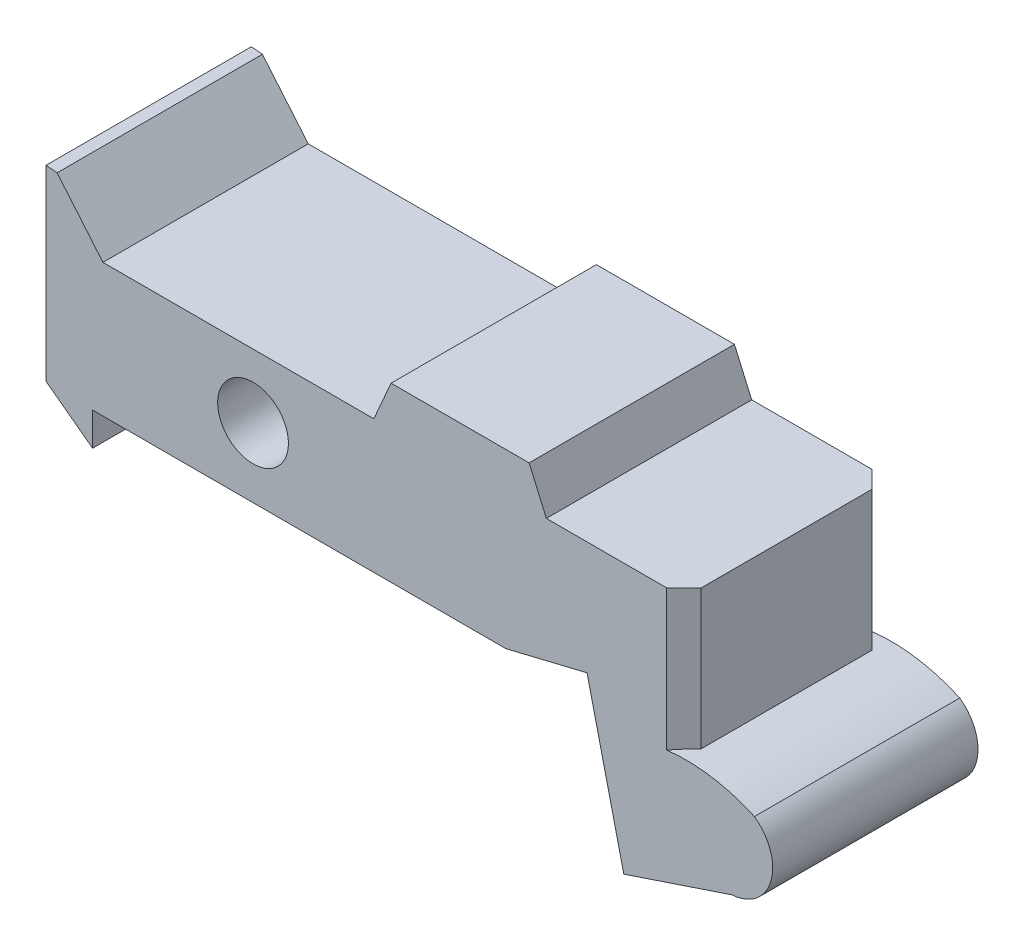
ISO-10303-21;
HEADER;
FILE_DESCRIPTION(('STEP AP214'),'2;1');
FILE_NAME('part.step','',(''),(''),'','','');
FILE_SCHEMA(('AUTOMOTIVE_DESIGN { 1 0 10303 214 1 1 1 1 }'));
ENDSEC;
DATA;
#1=APPLICATION_CONTEXT('core data for automotive mechanical design processes');
#2=APPLICATION_PROTOCOL_DEFINITION('international standard','automotive_design',2000,#1);
#3=PRODUCT_CONTEXT('',#1,'mechanical');
#4=PRODUCT('Part','Part','',(#3));
#5=PRODUCT_RELATED_PRODUCT_CATEGORY('part','',(#4));
#6=PRODUCT_DEFINITION_FORMATION('','',#4);
#7=PRODUCT_DEFINITION_CONTEXT('part definition',#1,'design');
#8=PRODUCT_DEFINITION('design','',#6,#7);
#9=PRODUCT_DEFINITION_SHAPE('','',#8);
#10=(LENGTH_UNIT() NAMED_UNIT(*) SI_UNIT(.MILLI.,.METRE.));
#11=(NAMED_UNIT(*) PLANE_ANGLE_UNIT() SI_UNIT($,.RADIAN.));
#12=(NAMED_UNIT(*) SI_UNIT($,.STERADIAN.) SOLID_ANGLE_UNIT());
#13=UNCERTAINTY_MEASURE_WITH_UNIT(LENGTH_MEASURE(1.E-05),#10,'distance_accuracy_value','');
#14=(GEOMETRIC_REPRESENTATION_CONTEXT(3) GLOBAL_UNCERTAINTY_ASSIGNED_CONTEXT((#13)) GLOBAL_UNIT_ASSIGNED_CONTEXT((#10,
#11,#12)) REPRESENTATION_CONTEXT('',''));
#15=CARTESIAN_POINT('',(0.,0.,0.));
#16=DIRECTION('',(0.,0.,1.));
#17=DIRECTION('',(1.,0.,0.));
#18=AXIS2_PLACEMENT_3D('',#15,#16,#17);
#19=CARTESIAN_POINT('',(27.5853303167742,-7.28137278331035,5.95));
#20=DIRECTION('',(0.,0.,-1.));
#21=DIRECTION('',(-1.,0.,0.));
#22=AXIS2_PLACEMENT_3D('',#19,#20,#21);
#23=PLANE('',#22);
#24=DIRECTION('',(-0.6427645261851,0.766063811883869,0.));
#25=VECTOR('',#24,1.);
#26=CARTESIAN_POINT('',(-12.,7.64572185949126,5.95));
#27=LINE('',#26,#25);
#28=CARTESIAN_POINT('',(-8.7,3.71269432572104,5.95));
#29=VERTEX_POINT('',#28);
#30=CARTESIAN_POINT('',(-11.3572354738149,6.8796580476074,5.95));
#31=VERTEX_POINT('',#30);
#32=EDGE_CURVE('E281',#29,#31,#27,.T.);
#33=ORIENTED_EDGE('',*,*,#32,.T.);
#34=DIRECTION('',(0.996192071376342,-0.0871857610330573,0.));
#35=VECTOR('',#34,1.);
#36=CARTESIAN_POINT('',(-12.,6.93591217368478,5.95));
#37=LINE('',#36,#35);
#38=CARTESIAN_POINT('',(-12.,6.93591217368478,5.95));
#39=VERTEX_POINT('',#38);
#40=EDGE_CURVE('E11',#31,#39,#37,.F.);
#41=ORIENTED_EDGE('',*,*,#40,.T.);
#42=DIRECTION('',(0.,-1.,0.));
#43=VECTOR('',#42,1.);
#44=CARTESIAN_POINT('',(-12.,4.14572185949126,5.95));
#45=LINE('',#44,#43);
#46=CARTESIAN_POINT('',(-12.,-3.90650539813591,5.95));
#47=VERTEX_POINT('',#46);
#48=EDGE_CURVE('E279',#39,#47,#45,.T.);
#49=ORIENTED_EDGE('',*,*,#48,.T.);
#50=DIRECTION('',(0.802165453491212,-0.597101821488796,0.));
#51=VECTOR('',#50,1.);
#52=CARTESIAN_POINT('',(-9.3,-5.91628394320188,5.95));
#53=LINE('',#52,#51);
#54=CARTESIAN_POINT('',(-9.3,-5.91628394320188,5.95));
#55=VERTEX_POINT('',#54);
#56=EDGE_CURVE('E277',#47,#55,#53,.T.);
#57=ORIENTED_EDGE('',*,*,#56,.T.);
#58=DIRECTION('',(0.,1.,0.));
#59=VECTOR('',#58,1.);
#60=CARTESIAN_POINT('',(-9.3,-4.,5.95));
#61=LINE('',#60,#59);
#62=CARTESIAN_POINT('',(-9.3,-4.,5.95));
#63=VERTEX_POINT('',#62);
#64=EDGE_CURVE('E275',#55,#63,#61,.T.);
#65=ORIENTED_EDGE('',*,*,#64,.T.);
#66=DIRECTION('',(1.,0.,0.));
#67=VECTOR('',#66,1.);
#68=CARTESIAN_POINT('',(-9.3,-4.,5.95));
#69=LINE('',#68,#67);
#70=CARTESIAN_POINT('',(14.656995803992,-4.,5.95));
#71=VERTEX_POINT('',#70);
#72=EDGE_CURVE('E273',#63,#71,#69,.T.);
#73=ORIENTED_EDGE('',*,*,#72,.T.);
#74=DIRECTION('',(0.971766267082924,0.235945591524233,0.));
#75=VECTOR('',#74,1.);
#76=CARTESIAN_POINT('',(14.656995803992,-4.,5.95));
#77=LINE('',#76,#75);
#78=CARTESIAN_POINT('',(19.3574684820404,-2.85872164528326,5.95));
#79=VERTEX_POINT('',#78);
#80=EDGE_CURVE('E201',#71,#79,#77,.T.);
#81=ORIENTED_EDGE('',*,*,#80,.T.);
#82=DIRECTION('',(0.229400824987985,-0.973332040721373,0.));
#83=VECTOR('',#82,1.);
#84=CARTESIAN_POINT('',(19.3574684820404,-2.85872164528326,5.95));
#85=LINE('',#84,#83);
#86=CARTESIAN_POINT('',(21.4882542868643,-11.8995003602598,5.95));
#87=VERTEX_POINT('',#86);
#88=EDGE_CURVE('E270',#79,#87,#85,.T.);
#89=ORIENTED_EDGE('',*,*,#88,.T.);
#90=DIRECTION('',(0.94847360678209,0.316856145968125,0.));
#91=VECTOR('',#90,1.);
#92=CARTESIAN_POINT('',(21.4882542868643,-11.8995003602598,5.95));
#93=LINE('',#92,#91);
#94=CARTESIAN_POINT('',(27.7466733727971,-9.80875314574336,5.95));
#95=VERTEX_POINT('',#94);
#96=EDGE_CURVE('E268',#87,#95,#93,.T.);
#97=ORIENTED_EDGE('',*,*,#96,.T.);
#98=CARTESIAN_POINT('',(27.5853303167742,-7.28137278331035,5.95));
#99=DIRECTION('',(0.,0.,1.));
#100=DIRECTION('',(-1.,0.,0.));
#101=AXIS2_PLACEMENT_3D('',#98,#99,#100);
#102=CIRCLE('',#101,2.53252503998259);
#103=CARTESIAN_POINT('',(29.0593321400907,-5.22200353448717,5.95));
#104=VERTEX_POINT('',#103);
#105=EDGE_CURVE('E266',#95,#104,#102,.T.);
#106=ORIENTED_EDGE('',*,*,#105,.T.);
#107=CARTESIAN_POINT('',(25.0886263646088,-13.9791283178024,5.95));
#108=DIRECTION('',(0.,0.,1.));
#109=DIRECTION('',(-1.,0.,0.));
#110=AXIS2_PLACEMENT_3D('',#107,#108,#109);
#111=CIRCLE('',#110,9.61528672614601);
#112=CARTESIAN_POINT('',(23.9748148702064,-4.42857007333647,5.95));
#113=VERTEX_POINT('',#112);
#114=EDGE_CURVE('E231',#104,#113,#111,.T.);
#115=ORIENTED_EDGE('',*,*,#114,.T.);
#116=DIRECTION('',(0.,1.,0.));
#117=VECTOR('',#116,1.);
#118=CARTESIAN_POINT('',(23.9748148702064,-7.28137278331035,5.95));
#119=LINE('',#118,#117);
#120=CARTESIAN_POINT('',(23.9748148702064,3.71269432572104,5.95));
#121=VERTEX_POINT('',#120);
#122=EDGE_CURVE('E409',#113,#121,#119,.T.);
#123=ORIENTED_EDGE('',*,*,#122,.T.);
#124=DIRECTION('',(-1.,0.,0.));
#125=VECTOR('',#124,1.);
#126=CARTESIAN_POINT('',(24.9748148702064,3.71269432572104,5.95));
#127=LINE('',#126,#125);
#128=CARTESIAN_POINT('',(17.,3.71269432572104,5.95));
#129=VERTEX_POINT('',#128);
#130=EDGE_CURVE('E234',#121,#129,#127,.T.);
#131=ORIENTED_EDGE('',*,*,#130,.T.);
#132=DIRECTION('',(-0.400584727732144,0.916259720771226,0.));
#133=VECTOR('',#132,1.);
#134=CARTESIAN_POINT('',(17.,3.71269432572104,5.95));
#135=LINE('',#134,#133);
#136=CARTESIAN_POINT('',(16.,6.,5.95));
#137=VERTEX_POINT('',#136);
#138=EDGE_CURVE('E289',#129,#137,#135,.T.);
#139=ORIENTED_EDGE('',*,*,#138,.T.);
#140=DIRECTION('',(-1.,0.,0.));
#141=VECTOR('',#140,1.);
#142=CARTESIAN_POINT('',(16.,6.,5.95));
#143=LINE('',#142,#141);
#144=CARTESIAN_POINT('',(8.,6.,5.95));
#145=VERTEX_POINT('',#144);
#146=EDGE_CURVE('E287',#137,#145,#143,.T.);
#147=ORIENTED_EDGE('',*,*,#146,.T.);
#148=DIRECTION('',(-0.400584727732145,-0.916259720771225,0.));
#149=VECTOR('',#148,1.);
#150=CARTESIAN_POINT('',(8.,6.,5.95));
#151=LINE('',#150,#149);
#152=CARTESIAN_POINT('',(7.,3.71269432572104,5.95));
#153=VERTEX_POINT('',#152);
#154=EDGE_CURVE('E285',#145,#153,#151,.T.);
#155=ORIENTED_EDGE('',*,*,#154,.T.);
#156=DIRECTION('',(-1.,0.,0.));
#157=VECTOR('',#156,1.);
#158=CARTESIAN_POINT('',(-8.7,3.71269432572104,5.95));
#159=LINE('',#158,#157);
#160=EDGE_CURVE('E283',#153,#29,#159,.T.);
#161=ORIENTED_EDGE('',*,*,#160,.T.);
#162=EDGE_LOOP('',(#33,#41,#49,#57,#65,#73,#81,#89,#97,#106,#115,#123,#131,#139,#147,#155,#161));
#163=FACE_BOUND('',#162,.T.);
#164=CARTESIAN_POINT('',(0.,0.,5.95));
#165=DIRECTION('',(0.,0.,1.));
#166=DIRECTION('',(1.,0.,0.));
#167=AXIS2_PLACEMENT_3D('',#164,#165,#166);
#168=CIRCLE('',#167,2.05);
#169=CARTESIAN_POINT('',(2.05,0.,5.95));
#170=VERTEX_POINT('',#169);
#171=EDGE_CURVE('E264',#170,#170,#168,.T.);
#172=ORIENTED_EDGE('',*,*,#171,.F.);
#173=EDGE_LOOP('',(#172));
#174=FACE_BOUND('',#173,.T.);
#175=ADVANCED_FACE('F33',(#163,#174),#23,.F.);
#176=CARTESIAN_POINT('',(27.5853303167742,-7.28137278331035,-5.95));
#177=DIRECTION('',(0.,0.,-1.));
#178=DIRECTION('',(-1.,0.,0.));
#179=AXIS2_PLACEMENT_3D('',#176,#177,#178);
#180=PLANE('',#179);
#181=DIRECTION('',(0.,-1.,0.));
#182=VECTOR('',#181,1.);
#183=CARTESIAN_POINT('',(-12.,-3.90650539813591,-5.95));
#184=LINE('',#183,#182);
#185=CARTESIAN_POINT('',(-12.,6.93591217368478,-5.95));
#186=VERTEX_POINT('',#185);
#187=CARTESIAN_POINT('',(-12.,-3.90650539813591,-5.95));
#188=VERTEX_POINT('',#187);
#189=EDGE_CURVE('E250',#186,#188,#184,.T.);
#190=ORIENTED_EDGE('',*,*,#189,.F.);
#191=DIRECTION('',(-0.996192071376342,0.0871857610330573,0.));
#192=VECTOR('',#191,1.);
#193=CARTESIAN_POINT('',(28.5192528026084,3.38970658382754,-5.95));
#194=LINE('',#193,#192);
#195=CARTESIAN_POINT('',(-11.3572354738149,6.8796580476074,-5.95));
#196=VERTEX_POINT('',#195);
#197=EDGE_CURVE('E55',#186,#196,#194,.F.);
#198=ORIENTED_EDGE('',*,*,#197,.T.);
#199=DIRECTION('',(-0.6427645261851,0.766063811883869,0.));
#200=VECTOR('',#199,1.);
#201=CARTESIAN_POINT('',(-12.,7.64572185949126,-5.95));
#202=LINE('',#201,#200);
#203=CARTESIAN_POINT('',(-8.7,3.71269432572104,-5.95));
#204=VERTEX_POINT('',#203);
#205=EDGE_CURVE('E252',#204,#196,#202,.T.);
#206=ORIENTED_EDGE('',*,*,#205,.F.);
#207=DIRECTION('',(-1.,0.,0.));
#208=VECTOR('',#207,1.);
#209=CARTESIAN_POINT('',(-8.7,3.71269432572104,-5.95));
#210=LINE('',#209,#208);
#211=CARTESIAN_POINT('',(7.,3.71269432572104,-5.95));
#212=VERTEX_POINT('',#211);
#213=EDGE_CURVE('E254',#212,#204,#210,.T.);
#214=ORIENTED_EDGE('',*,*,#213,.F.);
#215=DIRECTION('',(-0.400584727732145,-0.916259720771225,0.));
#216=VECTOR('',#215,1.);
#217=CARTESIAN_POINT('',(8.,6.,-5.95));
#218=LINE('',#217,#216);
#219=CARTESIAN_POINT('',(8.,6.,-5.95));
#220=VERTEX_POINT('',#219);
#221=EDGE_CURVE('E256',#220,#212,#218,.T.);
#222=ORIENTED_EDGE('',*,*,#221,.F.);
#223=DIRECTION('',(-1.,0.,0.));
#224=VECTOR('',#223,1.);
#225=CARTESIAN_POINT('',(16.,6.,-5.95));
#226=LINE('',#225,#224);
#227=CARTESIAN_POINT('',(16.,6.,-5.95));
#228=VERTEX_POINT('',#227);
#229=EDGE_CURVE('E258',#228,#220,#226,.T.);
#230=ORIENTED_EDGE('',*,*,#229,.F.);
#231=DIRECTION('',(-0.400584727732144,0.916259720771226,0.));
#232=VECTOR('',#231,1.);
#233=CARTESIAN_POINT('',(17.,3.71269432572104,-5.95));
#234=LINE('',#233,#232);
#235=CARTESIAN_POINT('',(17.,3.71269432572104,-5.95));
#236=VERTEX_POINT('',#235);
#237=EDGE_CURVE('E260',#236,#228,#234,.T.);
#238=ORIENTED_EDGE('',*,*,#237,.F.);
#239=DIRECTION('',(-1.,0.,0.));
#240=VECTOR('',#239,1.);
#241=CARTESIAN_POINT('',(17.,3.71269432572104,-5.95));
#242=LINE('',#241,#240);
#243=CARTESIAN_POINT('',(23.9748148702064,3.71269432572104,-5.95));
#244=VERTEX_POINT('',#243);
#245=EDGE_CURVE('E262',#244,#236,#242,.T.);
#246=ORIENTED_EDGE('',*,*,#245,.F.);
#247=DIRECTION('',(0.,-1.,0.));
#248=VECTOR('',#247,1.);
#249=CARTESIAN_POINT('',(23.9748148702064,-4.36451518103289,-5.95));
#250=LINE('',#249,#248);
#251=CARTESIAN_POINT('',(23.9748148702064,-4.42857007333647,-5.95));
#252=VERTEX_POINT('',#251);
#253=EDGE_CURVE('E389',#244,#252,#250,.T.);
#254=ORIENTED_EDGE('',*,*,#253,.T.);
#255=CARTESIAN_POINT('',(25.0886263646088,-13.9791283178024,-5.95));
#256=DIRECTION('',(0.,0.,1.));
#257=DIRECTION('',(-1.,0.,0.));
#258=AXIS2_PLACEMENT_3D('',#255,#256,#257);
#259=CIRCLE('',#258,9.61528672614601);
#260=CARTESIAN_POINT('',(29.0593321400907,-5.22200353448717,-5.95));
#261=VERTEX_POINT('',#260);
#262=EDGE_CURVE('E232',#261,#252,#259,.T.);
#263=ORIENTED_EDGE('',*,*,#262,.F.);
#264=CARTESIAN_POINT('',(27.5853303167742,-7.28137278331035,-5.95));
#265=DIRECTION('',(0.,0.,1.));
#266=DIRECTION('',(-1.,0.,0.));
#267=AXIS2_PLACEMENT_3D('',#264,#265,#266);
#268=CIRCLE('',#267,2.53252503998259);
#269=CARTESIAN_POINT('',(27.7466733727971,-9.80875314574336,-5.95));
#270=VERTEX_POINT('',#269);
#271=EDGE_CURVE('E235',#270,#261,#268,.T.);
#272=ORIENTED_EDGE('',*,*,#271,.F.);
#273=DIRECTION('',(0.94847360678209,0.316856145968125,0.));
#274=VECTOR('',#273,1.);
#275=CARTESIAN_POINT('',(21.4882542868643,-11.8995003602598,-5.95));
#276=LINE('',#275,#274);
#277=CARTESIAN_POINT('',(21.4882542868643,-11.8995003602598,-5.95));
#278=VERTEX_POINT('',#277);
#279=EDGE_CURVE('E237',#278,#270,#276,.T.);
#280=ORIENTED_EDGE('',*,*,#279,.F.);
#281=DIRECTION('',(0.229400824987985,-0.973332040721373,0.));
#282=VECTOR('',#281,1.);
#283=CARTESIAN_POINT('',(19.3574684820404,-2.85872164528326,-5.95));
#284=LINE('',#283,#282);
#285=CARTESIAN_POINT('',(19.3574684820404,-2.85872164528326,-5.95));
#286=VERTEX_POINT('',#285);
#287=EDGE_CURVE('E239',#286,#278,#284,.T.);
#288=ORIENTED_EDGE('',*,*,#287,.F.);
#289=DIRECTION('',(0.971766267082924,0.235945591524233,0.));
#290=VECTOR('',#289,1.);
#291=CARTESIAN_POINT('',(14.656995803992,-4.,-5.95));
#292=LINE('',#291,#290);
#293=CARTESIAN_POINT('',(14.656995803992,-4.,-5.95));
#294=VERTEX_POINT('',#293);
#295=EDGE_CURVE('E241',#294,#286,#292,.T.);
#296=ORIENTED_EDGE('',*,*,#295,.F.);
#297=DIRECTION('',(1.,0.,0.));
#298=VECTOR('',#297,1.);
#299=CARTESIAN_POINT('',(13.9925066147586,-4.,-5.95));
#300=LINE('',#299,#298);
#301=CARTESIAN_POINT('',(-9.3,-4.,-5.95));
#302=VERTEX_POINT('',#301);
#303=EDGE_CURVE('E243',#302,#294,#300,.T.);
#304=ORIENTED_EDGE('',*,*,#303,.F.);
#305=DIRECTION('',(0.,1.,0.));
#306=VECTOR('',#305,1.);
#307=CARTESIAN_POINT('',(-9.3,-4.,-5.95));
#308=LINE('',#307,#306);
#309=CARTESIAN_POINT('',(-9.3,-5.91628394320188,-5.95));
#310=VERTEX_POINT('',#309);
#311=EDGE_CURVE('E245',#310,#302,#308,.T.);
#312=ORIENTED_EDGE('',*,*,#311,.F.);
#313=DIRECTION('',(0.802165453491212,-0.597101821488796,0.));
#314=VECTOR('',#313,1.);
#315=CARTESIAN_POINT('',(-9.3,-5.91628394320188,-5.95));
#316=LINE('',#315,#314);
#317=EDGE_CURVE('E248',#188,#310,#316,.T.);
#318=ORIENTED_EDGE('',*,*,#317,.F.);
#319=EDGE_LOOP('',(#190,#198,#206,#214,#222,#230,#238,#246,#254,#263,#272,#280,#288,#296,#304,
#312,#318));
#320=FACE_BOUND('',#319,.T.);
#321=CARTESIAN_POINT('',(0.,0.,-5.95));
#322=DIRECTION('',(0.,0.,1.));
#323=DIRECTION('',(1.,0.,0.));
#324=AXIS2_PLACEMENT_3D('',#321,#322,#323);
#325=CIRCLE('',#324,2.05);
#326=CARTESIAN_POINT('',(2.05,0.,-5.95));
#327=VERTEX_POINT('',#326);
#328=EDGE_CURVE('E292',#327,#327,#325,.T.);
#329=ORIENTED_EDGE('',*,*,#328,.T.);
#330=EDGE_LOOP('',(#329));
#331=FACE_BOUND('',#330,.T.);
#332=ADVANCED_FACE('F324',(#320,#331),#180,.T.);
#333=CARTESIAN_POINT('',(17.,3.71269432572104,5.95));
#334=DIRECTION('',(0.,-1.,0.));
#335=DIRECTION('',(1.,0.,0.));
#336=AXIS2_PLACEMENT_3D('',#333,#334,#335);
#337=PLANE('',#336);
#338=ORIENTED_EDGE('',*,*,#130,.F.);
#339=DIRECTION('',(-0.707106781186548,0.,0.707106781186548));
#340=VECTOR('',#339,1.);
#341=CARTESIAN_POINT('',(23.9748148702064,3.71269432572104,5.95));
#342=LINE('',#341,#340);
#343=CARTESIAN_POINT('',(24.9748148702064,3.71269432572104,4.95));
#344=VERTEX_POINT('',#343);
#345=EDGE_CURVE('E406',#121,#344,#342,.F.);
#346=ORIENTED_EDGE('',*,*,#345,.T.);
#347=DIRECTION('',(0.,0.,-1.));
#348=VECTOR('',#347,1.);
#349=CARTESIAN_POINT('',(24.9748148702064,3.71269432572104,5.95));
#350=LINE('',#349,#348);
#351=CARTESIAN_POINT('',(24.9748148702064,3.71269432572104,-4.95));
#352=VERTEX_POINT('',#351);
#353=EDGE_CURVE('E228',#344,#352,#350,.T.);
#354=ORIENTED_EDGE('',*,*,#353,.T.);
#355=DIRECTION('',(-0.707106781186548,0.,-0.707106781186548));
#356=VECTOR('',#355,1.);
#357=CARTESIAN_POINT('',(24.9748148702064,3.71269432572104,-4.95));
#358=LINE('',#357,#356);
#359=EDGE_CURVE('E408',#352,#244,#358,.T.);
#360=ORIENTED_EDGE('',*,*,#359,.T.);
#361=ORIENTED_EDGE('',*,*,#245,.T.);
#362=DIRECTION('',(0.,0.,-1.));
#363=VECTOR('',#362,1.);
#364=CARTESIAN_POINT('',(17.,3.71269432572104,5.95));
#365=LINE('',#364,#363);
#366=EDGE_CURVE('E186',#129,#236,#365,.T.);
#367=ORIENTED_EDGE('',*,*,#366,.F.);
#368=EDGE_LOOP('',(#338,#346,#354,#360,#361,#367));
#369=FACE_BOUND('',#368,.T.);
#370=ADVANCED_FACE('F330',(#369),#337,.F.);
#371=CARTESIAN_POINT('',(17.,3.71269432572104,5.95));
#372=DIRECTION('',(-0.916259720771226,-0.400584727732144,0.));
#373=DIRECTION('',(0.400584727732144,-0.916259720771226,0.));
#374=AXIS2_PLACEMENT_3D('',#371,#372,#373);
#375=PLANE('',#374);
#376=ORIENTED_EDGE('',*,*,#237,.T.);
#377=DIRECTION('',(0.,0.,-1.));
#378=VECTOR('',#377,1.);
#379=CARTESIAN_POINT('',(16.,6.,5.95));
#380=LINE('',#379,#378);
#381=EDGE_CURVE('E469',#137,#228,#380,.T.);
#382=ORIENTED_EDGE('',*,*,#381,.F.);
#383=ORIENTED_EDGE('',*,*,#138,.F.);
#384=ORIENTED_EDGE('',*,*,#366,.T.);
#385=EDGE_LOOP('',(#376,#382,#383,#384));
#386=FACE_BOUND('',#385,.T.);
#387=ADVANCED_FACE('F456',(#386),#375,.F.);
#388=CARTESIAN_POINT('',(16.,6.,5.95));
#389=DIRECTION('',(0.,-1.,0.));
#390=DIRECTION('',(1.,0.,0.));
#391=AXIS2_PLACEMENT_3D('',#388,#389,#390);
#392=PLANE('',#391);
#393=ORIENTED_EDGE('',*,*,#229,.T.);
#394=DIRECTION('',(0.,0.,-1.));
#395=VECTOR('',#394,1.);
#396=CARTESIAN_POINT('',(8.,6.,5.95));
#397=LINE('',#396,#395);
#398=EDGE_CURVE('E476',#145,#220,#397,.T.);
#399=ORIENTED_EDGE('',*,*,#398,.F.);
#400=ORIENTED_EDGE('',*,*,#146,.F.);
#401=ORIENTED_EDGE('',*,*,#381,.T.);
#402=EDGE_LOOP('',(#393,#399,#400,#401));
#403=FACE_BOUND('',#402,.T.);
#404=ADVANCED_FACE('F453',(#403),#392,.F.);
#405=CARTESIAN_POINT('',(8.,6.,5.95));
#406=DIRECTION('',(0.916259720771225,-0.400584727732145,0.));
#407=DIRECTION('',(0.400584727732145,0.916259720771225,0.));
#408=AXIS2_PLACEMENT_3D('',#405,#406,#407);
#409=PLANE('',#408);
#410=ORIENTED_EDGE('',*,*,#221,.T.);
#411=DIRECTION('',(0.,0.,-1.));
#412=VECTOR('',#411,1.);
#413=CARTESIAN_POINT('',(7.,3.71269432572104,5.95));
#414=LINE('',#413,#412);
#415=EDGE_CURVE('E484',#153,#212,#414,.T.);
#416=ORIENTED_EDGE('',*,*,#415,.F.);
#417=ORIENTED_EDGE('',*,*,#154,.F.);
#418=ORIENTED_EDGE('',*,*,#398,.T.);
#419=EDGE_LOOP('',(#410,#416,#417,#418));
#420=FACE_BOUND('',#419,.T.);
#421=ADVANCED_FACE('F449',(#420),#409,.F.);
#422=CARTESIAN_POINT('',(-8.7,3.71269432572104,5.95));
#423=DIRECTION('',(0.,-1.,0.));
#424=DIRECTION('',(0.,0.,-1.));
#425=AXIS2_PLACEMENT_3D('',#422,#423,#424);
#426=PLANE('',#425);
#427=ORIENTED_EDGE('',*,*,#213,.T.);
#428=DIRECTION('',(0.,0.,-1.));
#429=VECTOR('',#428,1.);
#430=CARTESIAN_POINT('',(-8.7,3.71269432572104,5.95));
#431=LINE('',#430,#429);
#432=EDGE_CURVE('E488',#29,#204,#431,.T.);
#433=ORIENTED_EDGE('',*,*,#432,.F.);
#434=ORIENTED_EDGE('',*,*,#160,.F.);
#435=ORIENTED_EDGE('',*,*,#415,.T.);
#436=EDGE_LOOP('',(#427,#433,#434,#435));
#437=FACE_BOUND('',#436,.T.);
#438=ADVANCED_FACE('F446',(#437),#426,.F.);
#439=CARTESIAN_POINT('',(-12.,7.64572185949126,5.95));
#440=DIRECTION('',(-0.766063811883869,-0.6427645261851,0.));
#441=DIRECTION('',(0.6427645261851,-0.766063811883869,0.));
#442=AXIS2_PLACEMENT_3D('',#439,#440,#441);
#443=PLANE('',#442);
#444=ORIENTED_EDGE('',*,*,#205,.T.);
#445=DIRECTION('',(0.,0.,1.));
#446=VECTOR('',#445,1.);
#447=CARTESIAN_POINT('',(-11.3572354738149,6.8796580476074,5.95));
#448=LINE('',#447,#446);
#449=EDGE_CURVE('E41',#196,#31,#448,.T.);
#450=ORIENTED_EDGE('',*,*,#449,.T.);
#451=ORIENTED_EDGE('',*,*,#32,.F.);
#452=ORIENTED_EDGE('',*,*,#432,.T.);
#453=EDGE_LOOP('',(#444,#450,#451,#452));
#454=FACE_BOUND('',#453,.T.);
#455=ADVANCED_FACE('F442',(#454),#443,.F.);
#456=CARTESIAN_POINT('',(-12.,-3.90650539813591,5.95));
#457=DIRECTION('',(1.,0.,0.));
#458=DIRECTION('',(0.,0.,-1.));
#459=AXIS2_PLACEMENT_3D('',#456,#457,#458);
#460=PLANE('',#459);
#461=ORIENTED_EDGE('',*,*,#48,.F.);
#462=DIRECTION('',(0.,0.,-1.));
#463=VECTOR('',#462,1.);
#464=CARTESIAN_POINT('',(-12.,6.93591217368478,5.95));
#465=LINE('',#464,#463);
#466=EDGE_CURVE('E393',#39,#186,#465,.T.);
#467=ORIENTED_EDGE('',*,*,#466,.T.);
#468=ORIENTED_EDGE('',*,*,#189,.T.);
#469=DIRECTION('',(0.,0.,-1.));
#470=VECTOR('',#469,1.);
#471=CARTESIAN_POINT('',(-12.,-3.90650539813591,5.95));
#472=LINE('',#471,#470);
#473=EDGE_CURVE('E491',#47,#188,#472,.T.);
#474=ORIENTED_EDGE('',*,*,#473,.F.);
#475=EDGE_LOOP('',(#461,#467,#468,#474));
#476=FACE_BOUND('',#475,.T.);
#477=ADVANCED_FACE('F436',(#476),#460,.F.);
#478=CARTESIAN_POINT('',(-9.3,-5.91628394320188,5.95));
#479=DIRECTION('',(0.597101821488796,0.802165453491212,0.));
#480=DIRECTION('',(-0.802165453491212,0.597101821488796,0.));
#481=AXIS2_PLACEMENT_3D('',#478,#479,#480);
#482=PLANE('',#481);
#483=ORIENTED_EDGE('',*,*,#317,.T.);
#484=DIRECTION('',(0.,0.,-1.));
#485=VECTOR('',#484,1.);
#486=CARTESIAN_POINT('',(-9.3,-5.91628394320188,5.95));
#487=LINE('',#486,#485);
#488=EDGE_CURVE('E206',#55,#310,#487,.T.);
#489=ORIENTED_EDGE('',*,*,#488,.F.);
#490=ORIENTED_EDGE('',*,*,#56,.F.);
#491=ORIENTED_EDGE('',*,*,#473,.T.);
#492=EDGE_LOOP('',(#483,#489,#490,#491));
#493=FACE_BOUND('',#492,.T.);
#494=ADVANCED_FACE('F431',(#493),#482,.F.);
#495=CARTESIAN_POINT('',(-9.3,-4.,5.95));
#496=DIRECTION('',(-1.,0.,0.));
#497=DIRECTION('',(0.,0.,1.));
#498=AXIS2_PLACEMENT_3D('',#495,#496,#497);
#499=PLANE('',#498);
#500=ORIENTED_EDGE('',*,*,#311,.T.);
#501=DIRECTION('',(0.,0.,-1.));
#502=VECTOR('',#501,1.);
#503=CARTESIAN_POINT('',(-9.3,-4.,5.95));
#504=LINE('',#503,#502);
#505=EDGE_CURVE('E202',#63,#302,#504,.T.);
#506=ORIENTED_EDGE('',*,*,#505,.F.);
#507=ORIENTED_EDGE('',*,*,#64,.F.);
#508=ORIENTED_EDGE('',*,*,#488,.T.);
#509=EDGE_LOOP('',(#500,#506,#507,#508));
#510=FACE_BOUND('',#509,.T.);
#511=ADVANCED_FACE('F427',(#510),#499,.F.);
#512=CARTESIAN_POINT('',(13.9925066147586,-4.,5.95));
#513=DIRECTION('',(0.,1.,0.));
#514=DIRECTION('',(0.,0.,1.));
#515=AXIS2_PLACEMENT_3D('',#512,#513,#514);
#516=PLANE('',#515);
#517=DIRECTION('',(0.,0.,-1.));
#518=VECTOR('',#517,1.);
#519=CARTESIAN_POINT('',(14.656995803992,-4.,5.95));
#520=LINE('',#519,#518);
#521=CARTESIAN_POINT('',(14.656995803992,-4.,-4.71745322240221));
#522=VERTEX_POINT('',#521);
#523=EDGE_CURVE('E195',#522,#294,#520,.T.);
#524=ORIENTED_EDGE('',*,*,#523,.F.);
#525=CARTESIAN_POINT('',(13.,-4.,0.));
#526=DIRECTION('',(0.,-1.,0.));
#527=DIRECTION('',(0.,0.,-1.));
#528=AXIS2_PLACEMENT_3D('',#525,#526,#527);
#529=CIRCLE('',#528,4.99999999999999);
#530=CARTESIAN_POINT('',(14.656995803992,-4.,4.71745322240221));
#531=VERTEX_POINT('',#530);
#532=EDGE_CURVE('E181',#531,#522,#529,.T.);
#533=ORIENTED_EDGE('',*,*,#532,.F.);
#534=EDGE_CURVE('E192',#71,#531,#520,.T.);
#535=ORIENTED_EDGE('',*,*,#534,.F.);
#536=ORIENTED_EDGE('',*,*,#72,.F.);
#537=ORIENTED_EDGE('',*,*,#505,.T.);
#538=ORIENTED_EDGE('',*,*,#303,.T.);
#539=EDGE_LOOP('',(#524,#533,#535,#536,#537,#538));
#540=FACE_BOUND('',#539,.T.);
#541=ADVANCED_FACE('F190',(#540),#516,.F.);
#542=CARTESIAN_POINT('',(14.656995803992,-4.,5.95));
#543=DIRECTION('',(-0.235945591524233,0.971766267082924,0.));
#544=DIRECTION('',(-0.971766267082924,-0.235945591524233,0.));
#545=AXIS2_PLACEMENT_3D('',#542,#543,#544);
#546=PLANE('',#545);
#547=ORIENTED_EDGE('',*,*,#534,.T.);
#548=CARTESIAN_POINT('',(13.,-4.40231984621122,0.));
#549=DIRECTION('',(-0.235945591524233,0.971766267082924,0.));
#550=DIRECTION('',(-0.971766267082924,-0.235945591524233,0.));
#551=AXIS2_PLACEMENT_3D('',#548,#549,#550);
#552=ELLIPSE('',#551,5.14527018416593,4.99999999999999);
#553=EDGE_CURVE('E178',#531,#522,#552,.T.);
#554=ORIENTED_EDGE('',*,*,#553,.T.);
#555=ORIENTED_EDGE('',*,*,#523,.T.);
#556=ORIENTED_EDGE('',*,*,#295,.T.);
#557=DIRECTION('',(0.,0.,-1.));
#558=VECTOR('',#557,1.);
#559=CARTESIAN_POINT('',(19.3574684820404,-2.85872164528326,5.95));
#560=LINE('',#559,#558);
#561=EDGE_CURVE('E210',#79,#286,#560,.T.);
#562=ORIENTED_EDGE('',*,*,#561,.F.);
#563=ORIENTED_EDGE('',*,*,#80,.F.);
#564=EDGE_LOOP('',(#547,#554,#555,#556,#562,#563));
#565=FACE_BOUND('',#564,.T.);
#566=ADVANCED_FACE('F199',(#565),#546,.F.);
#567=CARTESIAN_POINT('',(19.3574684820404,-2.85872164528326,5.95));
#568=DIRECTION('',(0.973332040721373,0.229400824987985,0.));
#569=DIRECTION('',(-0.229400824987985,0.973332040721373,0.));
#570=AXIS2_PLACEMENT_3D('',#567,#568,#569);
#571=PLANE('',#570);
#572=ORIENTED_EDGE('',*,*,#287,.T.);
#573=DIRECTION('',(0.,0.,-1.));
#574=VECTOR('',#573,1.);
#575=CARTESIAN_POINT('',(21.4882542868643,-11.8995003602598,5.95));
#576=LINE('',#575,#574);
#577=EDGE_CURVE('E212',#87,#278,#576,.T.);
#578=ORIENTED_EDGE('',*,*,#577,.F.);
#579=ORIENTED_EDGE('',*,*,#88,.F.);
#580=ORIENTED_EDGE('',*,*,#561,.T.);
#581=EDGE_LOOP('',(#572,#578,#579,#580));
#582=FACE_BOUND('',#581,.T.);
#583=ADVANCED_FACE('F348',(#582),#571,.F.);
#584=CARTESIAN_POINT('',(21.4882542868643,-11.8995003602598,5.95));
#585=DIRECTION('',(-0.316856145968125,0.94847360678209,0.));
#586=DIRECTION('',(-0.94847360678209,-0.316856145968125,0.));
#587=AXIS2_PLACEMENT_3D('',#584,#585,#586);
#588=PLANE('',#587);
#589=ORIENTED_EDGE('',*,*,#279,.T.);
#590=DIRECTION('',(0.,0.,-1.));
#591=VECTOR('',#590,1.);
#592=CARTESIAN_POINT('',(27.7466733727971,-9.80875314574336,5.95));
#593=LINE('',#592,#591);
#594=EDGE_CURVE('E217',#95,#270,#593,.T.);
#595=ORIENTED_EDGE('',*,*,#594,.F.);
#596=ORIENTED_EDGE('',*,*,#96,.F.);
#597=ORIENTED_EDGE('',*,*,#577,.T.);
#598=EDGE_LOOP('',(#589,#595,#596,#597));
#599=FACE_BOUND('',#598,.T.);
#600=ADVANCED_FACE('F344',(#599),#588,.F.);
#601=CARTESIAN_POINT('',(27.5853303167742,-7.28137278331035,5.95));
#602=DIRECTION('',(0.,0.,-1.));
#603=DIRECTION('',(-1.,0.,0.));
#604=AXIS2_PLACEMENT_3D('',#601,#602,#603);
#605=CYLINDRICAL_SURFACE('',#604,2.53252503998259);
#606=ORIENTED_EDGE('',*,*,#271,.T.);
#607=DIRECTION('',(0.,0.,-1.));
#608=VECTOR('',#607,1.);
#609=CARTESIAN_POINT('',(29.0593321400907,-5.22200353448717,5.95));
#610=LINE('',#609,#608);
#611=EDGE_CURVE('E222',#104,#261,#610,.T.);
#612=ORIENTED_EDGE('',*,*,#611,.F.);
#613=ORIENTED_EDGE('',*,*,#105,.F.);
#614=ORIENTED_EDGE('',*,*,#594,.T.);
#615=EDGE_LOOP('',(#606,#612,#613,#614));
#616=FACE_BOUND('',#615,.T.);
#617=ADVANCED_FACE('F340',(#616),#605,.T.);
#618=CARTESIAN_POINT('',(25.0886263646088,-13.9791283178024,5.95));
#619=DIRECTION('',(0.,0.,-1.));
#620=DIRECTION('',(-1.,0.,0.));
#621=AXIS2_PLACEMENT_3D('',#618,#619,#620);
#622=CYLINDRICAL_SURFACE('',#621,9.61528672614601);
#623=ORIENTED_EDGE('',*,*,#262,.T.);
#624=CARTESIAN_POINT('',(25.0886263646088,-13.9791283178024,-4.83618850559762));
#625=DIRECTION('',(0.707106781186547,0.,-0.707106781186547));
#626=DIRECTION('',(-0.707106781186548,0.,-0.707106781186548));
#627=AXIS2_PLACEMENT_3D('',#624,#625,#626);
#628=ELLIPSE('',#627,13.5980688942217,9.61528672614601);
#629=CARTESIAN_POINT('',(24.9748148702064,-4.36451518103289,-4.95));
#630=VERTEX_POINT('',#629);
#631=EDGE_CURVE('E387',#252,#630,#628,.T.);
#632=ORIENTED_EDGE('',*,*,#631,.T.);
#633=DIRECTION('',(0.,0.,-1.));
#634=VECTOR('',#633,1.);
#635=CARTESIAN_POINT('',(24.9748148702064,-4.36451518103289,5.95));
#636=LINE('',#635,#634);
#637=CARTESIAN_POINT('',(24.9748148702064,-4.36451518103289,4.95));
#638=VERTEX_POINT('',#637);
#639=EDGE_CURVE('E225',#638,#630,#636,.T.);
#640=ORIENTED_EDGE('',*,*,#639,.F.);
#641=CARTESIAN_POINT('',(25.0886263646088,-13.9791283178024,4.83618850559762));
#642=DIRECTION('',(-0.707106781186547,0.,-0.707106781186547));
#643=DIRECTION('',(0.707106781186548,0.,-0.707106781186548));
#644=AXIS2_PLACEMENT_3D('',#641,#642,#643);
#645=ELLIPSE('',#644,13.5980688942217,9.61528672614601);
#646=EDGE_CURVE('E394',#638,#113,#645,.F.);
#647=ORIENTED_EDGE('',*,*,#646,.T.);
#648=ORIENTED_EDGE('',*,*,#114,.F.);
#649=ORIENTED_EDGE('',*,*,#611,.T.);
#650=EDGE_LOOP('',(#623,#632,#640,#647,#648,#649));
#651=FACE_BOUND('',#650,.T.);
#652=ADVANCED_FACE('F336',(#651),#622,.T.);
#653=CARTESIAN_POINT('',(24.9748148702064,-4.36451518103289,5.95));
#654=DIRECTION('',(-1.,0.,0.));
#655=DIRECTION('',(0.,0.,1.));
#656=AXIS2_PLACEMENT_3D('',#653,#654,#655);
#657=PLANE('',#656);
#658=ORIENTED_EDGE('',*,*,#353,.F.);
#659=DIRECTION('',(0.,-1.,0.));
#660=VECTOR('',#659,1.);
#661=CARTESIAN_POINT('',(24.9748148702064,-4.36451518103289,4.95));
#662=LINE('',#661,#660);
#663=EDGE_CURVE('E403',#344,#638,#662,.T.);
#664=ORIENTED_EDGE('',*,*,#663,.T.);
#665=ORIENTED_EDGE('',*,*,#639,.T.);
#666=DIRECTION('',(0.,1.,0.));
#667=VECTOR('',#666,1.);
#668=CARTESIAN_POINT('',(24.9748148702064,3.71269432572104,-4.95));
#669=LINE('',#668,#667);
#670=EDGE_CURVE('E391',#630,#352,#669,.T.);
#671=ORIENTED_EDGE('',*,*,#670,.T.);
#672=EDGE_LOOP('',(#658,#664,#665,#671));
#673=FACE_BOUND('',#672,.T.);
#674=ADVANCED_FACE('F320',(#673),#657,.F.);
#675=CARTESIAN_POINT('',(0.,0.,5.95));
#676=DIRECTION('',(0.,0.,-1.));
#677=DIRECTION('',(-1.,0.,0.));
#678=AXIS2_PLACEMENT_3D('',#675,#676,#677);
#679=CYLINDRICAL_SURFACE('',#678,2.05);
#680=ORIENTED_EDGE('',*,*,#171,.T.);
#681=EDGE_LOOP('',(#680));
#682=FACE_BOUND('',#681,.T.);
#683=ORIENTED_EDGE('',*,*,#328,.F.);
#684=EDGE_LOOP('',(#683));
#685=FACE_BOUND('',#684,.T.);
#686=ADVANCED_FACE('F312',(#682,#685),#679,.F.);
#687=CARTESIAN_POINT('',(13.,-1.,0.));
#688=DIRECTION('',(0.,-1.,0.));
#689=DIRECTION('',(0.,0.,-1.));
#690=AXIS2_PLACEMENT_3D('',#687,#688,#689);
#691=CYLINDRICAL_SURFACE('',#690,4.99999999999999);
#692=CARTESIAN_POINT('',(13.,-1.,0.));
#693=DIRECTION('',(0.,-1.,0.));
#694=DIRECTION('',(0.,0.,-1.));
#695=AXIS2_PLACEMENT_3D('',#692,#693,#694);
#696=CIRCLE('',#695,4.99999999999999);
#697=CARTESIAN_POINT('',(13.,-1.,-4.99999999999999));
#698=VERTEX_POINT('',#697);
#699=EDGE_CURVE('E196',#698,#698,#696,.T.);
#700=ORIENTED_EDGE('',*,*,#699,.F.);
#701=EDGE_LOOP('',(#700));
#702=FACE_BOUND('',#701,.T.);
#703=ORIENTED_EDGE('',*,*,#532,.T.);
#704=ORIENTED_EDGE('',*,*,#553,.F.);
#705=EDGE_LOOP('',(#703,#704));
#706=FACE_BOUND('',#705,.T.);
#707=ADVANCED_FACE('F180',(#702,#706),#691,.F.);
#708=CARTESIAN_POINT('',(13.,-1.,0.));
#709=DIRECTION('',(0.,-1.,0.));
#710=DIRECTION('',(0.,0.,-1.));
#711=AXIS2_PLACEMENT_3D('',#708,#709,#710);
#712=CYLINDRICAL_SURFACE('',#711,4.3);
#713=CARTESIAN_POINT('',(13.,-3.,0.));
#714=DIRECTION('',(0.,1.,0.));
#715=DIRECTION('',(0.,0.,1.));
#716=AXIS2_PLACEMENT_3D('',#713,#714,#715);
#717=CIRCLE('',#716,4.3);
#718=CARTESIAN_POINT('',(15.1591157445956,-3.,3.7186313613263));
#719=VERTEX_POINT('',#718);
#720=EDGE_CURVE('E364',#719,#719,#717,.T.);
#721=ORIENTED_EDGE('',*,*,#720,.T.);
#722=EDGE_LOOP('',(#721));
#723=FACE_BOUND('',#722,.T.);
#724=CARTESIAN_POINT('',(13.,-1.,0.));
#725=DIRECTION('',(0.,-1.,0.));
#726=DIRECTION('',(0.,0.,-1.));
#727=AXIS2_PLACEMENT_3D('',#724,#725,#726);
#728=CIRCLE('',#727,4.3);
#729=CARTESIAN_POINT('',(13.,-1.,-4.3));
#730=VERTEX_POINT('',#729);
#731=EDGE_CURVE('E197',#730,#730,#728,.T.);
#732=ORIENTED_EDGE('',*,*,#731,.T.);
#733=EDGE_LOOP('',(#732));
#734=FACE_BOUND('',#733,.T.);
#735=ADVANCED_FACE('F302',(#723,#734),#712,.T.);
#736=CARTESIAN_POINT('',(13.,-1.,0.));
#737=DIRECTION('',(0.,-1.,0.));
#738=DIRECTION('',(0.,0.,-1.));
#739=AXIS2_PLACEMENT_3D('',#736,#737,#738);
#740=PLANE('',#739);
#741=ORIENTED_EDGE('',*,*,#731,.F.);
#742=EDGE_LOOP('',(#741));
#743=FACE_BOUND('',#742,.T.);
#744=ORIENTED_EDGE('',*,*,#699,.T.);
#745=EDGE_LOOP('',(#744));
#746=FACE_BOUND('',#745,.T.);
#747=ADVANCED_FACE('F304',(#743,#746),#740,.T.);
#748=CARTESIAN_POINT('',(14.656995803992,-4.,2.85383337031993));
#749=VERTEX_POINT('',#748);
#750=CARTESIAN_POINT('',(14.656995803992,-4.,-2.85383337032018));
#751=VERTEX_POINT('',#750);
#752=EDGE_CURVE('E203',#749,#751,#520,.T.);
#753=ORIENTED_EDGE('',*,*,#752,.T.);
#754=CARTESIAN_POINT('',(14.656995803992,-4.,-2.85383337032018));
#755=CARTESIAN_POINT('',(14.6569640389556,-4.00000771257508,-2.8679799290921));
#756=CARTESIAN_POINT('',(14.6579163393533,-3.9997764933115,-2.88221017274456));
#757=CARTESIAN_POINT('',(14.6621106584538,-3.99875810943182,-2.91034524212772));
#758=CARTESIAN_POINT('',(14.6653602001203,-3.9979691182344,-2.92424884318585));
#759=CARTESIAN_POINT('',(14.6736910826664,-3.99594637359215,-2.94882513980888));
#760=CARTESIAN_POINT('',(14.6783612058093,-3.99481246412774,-2.95964221970734));
#761=CARTESIAN_POINT('',(14.6894268746939,-3.99212571127469,-2.98025358060743));
#762=CARTESIAN_POINT('',(14.6958170238576,-3.99057417817931,-2.99005092990678));
#763=CARTESIAN_POINT('',(14.7100761972247,-3.98711203999988,-3.00838323466051));
#764=CARTESIAN_POINT('',(14.7179416979001,-3.98520229043111,-3.01692111301775));
#765=CARTESIAN_POINT('',(14.7348395275983,-3.98109948448007,-3.03268799122751));
#766=CARTESIAN_POINT('',(14.7438742124388,-3.97890585610344,-3.03991427570068));
#767=CARTESIAN_POINT('',(14.7678495624394,-3.97308462281975,-3.05662353178772));
#768=CARTESIAN_POINT('',(14.7833591377139,-3.96931888610263,-3.06523845626296));
#769=CARTESIAN_POINT('',(14.8154752908768,-3.9615210595962,-3.0798992215765));
#770=CARTESIAN_POINT('',(14.8320844867783,-3.95748833415135,-3.08593865644099));
#771=CARTESIAN_POINT('',(14.8783728325531,-3.94624948845928,-3.09963570490742));
#772=CARTESIAN_POINT('',(14.9086312411193,-3.93890272375919,-3.10518528604439));
#773=CARTESIAN_POINT('',(14.9695788441951,-3.92410459920309,-3.11182472392197));
#774=CARTESIAN_POINT('',(15.0002689874785,-3.91665300898408,-3.11290239396903));
#775=CARTESIAN_POINT('',(15.0910664924737,-3.8946073054536,-3.11116764321113));
#776=CARTESIAN_POINT('',(15.1510766197714,-3.88003680073213,-3.10361672081116));
#777=CARTESIAN_POINT('',(15.2694365951315,-3.85129890835504,-3.08006138977208));
#778=CARTESIAN_POINT('',(15.3277822285807,-3.8371325440107,-3.06403723712196));
#779=CARTESIAN_POINT('',(15.4368555780751,-3.81064945148349,-3.02737206177108));
#780=CARTESIAN_POINT('',(15.4877746752159,-3.79828625582449,-3.00732667288948));
#781=CARTESIAN_POINT('',(15.5877824316394,-3.77400429621582,-2.96284289789442));
#782=CARTESIAN_POINT('',(15.6368697385811,-3.76208586061562,-2.93840134081047));
#783=CARTESIAN_POINT('',(15.7812782204187,-3.72702337097954,-2.85940760393466));
#784=CARTESIAN_POINT('',(15.8736991478767,-3.70458349923574,-2.79920328152194));
#785=CARTESIAN_POINT('',(16.0882775845173,-3.65248369100356,-2.63852552216273));
#786=CARTESIAN_POINT('',(16.2060478304064,-3.62388898539222,-2.53188800430899));
#787=CARTESIAN_POINT('',(16.4233027501929,-3.57113932500893,-2.30057296167056));
#788=CARTESIAN_POINT('',(16.5227758179498,-3.54698718821673,-2.17588407565162));
#789=CARTESIAN_POINT('',(16.7044481805283,-3.50287699988836,-1.9100960822162));
#790=CARTESIAN_POINT('',(16.7862581172934,-3.48301348478554,-1.76871645246317));
#791=CARTESIAN_POINT('',(16.9294017714001,-3.44825809628812,-1.4754635546537));
#792=CARTESIAN_POINT('',(16.9907355552447,-3.43336620674655,-1.32359032068059));
#793=CARTESIAN_POINT('',(17.1010975881104,-3.40657022091296,-0.986504121454256));
#794=CARTESIAN_POINT('',(17.1463392498142,-3.39558551091238,-0.799970210244768));
#795=CARTESIAN_POINT('',(17.2080207251849,-3.38060920160284,-0.421879425128669));
#796=CARTESIAN_POINT('',(17.2244429537481,-3.37662187197045,-0.230319556766686));
#797=CARTESIAN_POINT('',(17.2284601534054,-3.37564649282681,0.166854626717447));
#798=CARTESIAN_POINT('',(17.2139129411391,-3.37917856707085,0.372495780597024));
#799=CARTESIAN_POINT('',(17.1516585799502,-3.39429397349443,0.778494587965694));
#800=CARTESIAN_POINT('',(17.10393941626,-3.4058802228687,0.978850299785778));
#801=CARTESIAN_POINT('',(16.9755162275633,-3.4370614711265,1.36901558665764));
#802=CARTESIAN_POINT('',(16.8946777029561,-3.45668912661577,1.55877853069831));
#803=CARTESIAN_POINT('',(16.7008097660728,-3.50376040969583,1.92012176533129));
#804=CARTESIAN_POINT('',(16.5878080436705,-3.53119731416411,2.09171752278837));
#805=CARTESIAN_POINT('',(16.3674433652661,-3.58470202631394,2.36381198803649));
#806=CARTESIAN_POINT('',(16.2674824807207,-3.6089726053948,2.4707114933091));
#807=CARTESIAN_POINT('',(16.0525374260343,-3.66116142876838,2.66708704754098));
#808=CARTESIAN_POINT('',(15.9375845888647,-3.68907206539173,2.75659849205893));
#809=CARTESIAN_POINT('',(15.7441404915142,-3.73604043990963,2.88032357835063));
#810=CARTESIAN_POINT('',(15.6701783390438,-3.75399850699445,2.92211359137342));
#811=CARTESIAN_POINT('',(15.5177150245972,-3.79101671613732,2.99589583594271));
#812=CARTESIAN_POINT('',(15.4392192290391,-3.81007555522493,3.027899380068));
#813=CARTESIAN_POINT('',(15.3105417799418,-3.84131853810212,3.0686298147457));
#814=CARTESIAN_POINT('',(15.2616058305037,-3.85320022398491,3.0815459846343));
#815=CARTESIAN_POINT('',(15.1625764235489,-3.87724463959565,3.10139997291766));
#816=CARTESIAN_POINT('',(15.1124849012999,-3.88940689943913,3.10834713352043));
#817=CARTESIAN_POINT('',(15.0337124927281,-3.90853290037767,3.11271534062531));
#818=CARTESIAN_POINT('',(15.0051821318349,-3.91546009378351,3.11296339965303));
#819=CARTESIAN_POINT('',(14.9482553660414,-3.92928195597782,3.11003551193104));
#820=CARTESIAN_POINT('',(14.9198588704901,-3.93617664677643,3.10686237234443));
#821=CARTESIAN_POINT('',(14.8729367950382,-3.94756936251793,3.09767733003001));
#822=CARTESIAN_POINT('',(14.8541855872742,-3.95212217007829,3.09291345591633));
#823=CARTESIAN_POINT('',(14.8175061692314,-3.96102796078127,3.08072155013464));
#824=CARTESIAN_POINT('',(14.7995764718435,-3.96538130499515,3.07329856583864));
#825=CARTESIAN_POINT('',(14.7706093060379,-3.97241455496717,3.0579401888659));
#826=CARTESIAN_POINT('',(14.7591470705725,-3.97519759448881,3.05086330324323));
#827=CARTESIAN_POINT('',(14.737435721485,-3.98046912662237,3.03494234889466));
#828=CARTESIAN_POINT('',(14.7271853981154,-3.98295791296193,3.02610006653484));
#829=CARTESIAN_POINT('',(14.7083135314233,-3.98754001660212,3.00649805571955));
#830=CARTESIAN_POINT('',(14.6997126214604,-3.98962832410731,2.99571694493207));
#831=CARTESIAN_POINT('',(14.6848214187793,-3.99324391948671,2.9725986188768));
#832=CARTESIAN_POINT('',(14.6785269673683,-3.99477221709468,2.96026425873425));
#833=CARTESIAN_POINT('',(14.6691944457203,-3.99703816047555,2.93653695922912));
#834=CARTESIAN_POINT('',(14.6658068120979,-3.99786068050529,2.92528593974088));
#835=CARTESIAN_POINT('',(14.6607003958216,-3.99910052227556,2.90234226594462));
#836=CARTESIAN_POINT('',(14.6589897017955,-3.99951588009109,2.8906477509949));
#837=CARTESIAN_POINT('',(14.6564151051017,-4.00014099413388,2.85972518216172));
#838=CARTESIAN_POINT('',(14.6567683225271,-4.00005523267332,2.84040376498958));
#839=CARTESIAN_POINT('',(14.6602876838088,-3.99920072906734,2.80229504376075));
#840=CARTESIAN_POINT('',(14.6634125636242,-3.99844200586254,2.78350406151924));
#841=CARTESIAN_POINT('',(14.6674085472949,-3.99747177797664,2.76510004231018));
#842=B_SPLINE_CURVE_WITH_KNOTS('',3,(#754,#755,#756,#757,#758,#759,#760,#761,#762,#763,#764,
#765,#766,#767,#768,#769,#770,#771,#772,#773,#774,#775,#776,#777,#778,#779,#780,#781,#782,#783,
#784,#785,#786,#787,#788,#789,#790,#791,#792,#793,#794,#795,#796,#797,#798,#799,#800,#801,#802,
#803,#804,#805,#806,#807,#808,#809,#810,#811,#812,#813,#814,#815,#816,#817,#818,#819,#820,#821,
#822,#823,#824,#825,#826,#827,#828,#829,#830,#831,#832,#833,#834,#835,#836,#837,#838,#839,#840,
#841),.UNSPECIFIED.,.F.,.F.,(4,2,2,2,2,2,2,2,2,2,2,2,2,2,2,2,2,2,2,2,2,2,2,2,2,2,2,2,2,2,2,2,2,
2,2,2,2,2,2,2,2,2,2,4),(0.,0.0425344848393137,0.0852089099632602,0.120543133858615,
0.15576776349377,0.190909314538125,0.226122808955315,0.280220667216604,0.334452308309672,
0.428802694296001,0.523410032429649,0.709012351702168,0.895049072981914,1.06311190140025,
1.2312964438076,1.56781696588588,2.04961695775402,2.53172151565771,3.0235609368009,
3.51539876051974,4.08968848245203,4.66432850403658,5.28000146046706,5.895897527806,
6.51431997514313,7.13221161360472,7.57579555242859,8.01846683465015,8.27846370575592,
8.53815888977065,8.69388544424957,8.84936782188095,8.93731662265946,9.0251933145368,
9.08468479882812,9.14406395296042,9.18519510753456,9.22628485143137,9.26785915776455,
9.30935812973931,9.34454862588488,9.37990803831562,9.43759879884602,9.49444482170438),.UNSPECIFIED.);
#843=EDGE_CURVE('E357',#751,#749,#842,.T.);
#844=ORIENTED_EDGE('',*,*,#843,.T.);
#845=EDGE_LOOP('',(#753,#844));
#846=FACE_BOUND('',#845,.T.);
#847=ADVANCED_FACE('F307',(#846),#546,.F.);
#848=ORIENTED_EDGE('',*,*,#752,.F.);
#849=CARTESIAN_POINT('',(13.,-4.,0.));
#850=DIRECTION('',(0.,1.,0.));
#851=DIRECTION('',(0.,0.,1.));
#852=AXIS2_PLACEMENT_3D('',#849,#850,#851);
#853=CIRCLE('',#852,3.3);
#854=EDGE_CURVE('E185',#749,#751,#853,.F.);
#855=ORIENTED_EDGE('',*,*,#854,.T.);
#856=EDGE_LOOP('',(#848,#855));
#857=FACE_BOUND('',#856,.T.);
#858=ADVANCED_FACE('F372',(#857),#516,.F.);
#859=CARTESIAN_POINT('',(13.,-3.,0.));
#860=DIRECTION('',(0.,1.,0.));
#861=DIRECTION('',(0.,0.,1.));
#862=AXIS2_PLACEMENT_3D('',#859,#860,#861);
#863=TOROIDAL_SURFACE('',#862,3.3,1.);
#864=ORIENTED_EDGE('',*,*,#720,.F.);
#865=EDGE_LOOP('',(#864));
#866=FACE_BOUND('',#865,.T.);
#867=ORIENTED_EDGE('',*,*,#843,.F.);
#868=ORIENTED_EDGE('',*,*,#854,.F.);
#869=EDGE_LOOP('',(#867,#868));
#870=FACE_BOUND('',#869,.T.);
#871=ADVANCED_FACE('F366',(#866,#870),#863,.T.);
#872=CARTESIAN_POINT('',(23.9748148702064,-7.28137278331035,5.95));
#873=DIRECTION('',(-0.707106781186547,0.,-0.707106781186547));
#874=DIRECTION('',(0.,1.,0.));
#875=AXIS2_PLACEMENT_3D('',#872,#873,#874);
#876=PLANE('',#875);
#877=ORIENTED_EDGE('',*,*,#646,.F.);
#878=ORIENTED_EDGE('',*,*,#663,.F.);
#879=ORIENTED_EDGE('',*,*,#345,.F.);
#880=ORIENTED_EDGE('',*,*,#122,.F.);
#881=EDGE_LOOP('',(#877,#878,#879,#880));
#882=FACE_BOUND('',#881,.T.);
#883=ADVANCED_FACE('F371',(#882),#876,.F.);
#884=CARTESIAN_POINT('',(24.9748148702064,-4.36451518103289,-4.95));
#885=DIRECTION('',(0.707106781186547,0.,-0.707106781186547));
#886=DIRECTION('',(0.,-1.,0.));
#887=AXIS2_PLACEMENT_3D('',#884,#885,#886);
#888=PLANE('',#887);
#889=ORIENTED_EDGE('',*,*,#631,.F.);
#890=ORIENTED_EDGE('',*,*,#253,.F.);
#891=ORIENTED_EDGE('',*,*,#359,.F.);
#892=ORIENTED_EDGE('',*,*,#670,.F.);
#893=EDGE_LOOP('',(#889,#890,#891,#892));
#894=FACE_BOUND('',#893,.T.);
#895=ADVANCED_FACE('F376',(#894),#888,.T.);
#896=CARTESIAN_POINT('',(-12.,6.93591217368478,5.95));
#897=DIRECTION('',(-0.0871857610330573,-0.996192071376342,0.));
#898=DIRECTION('',(0.,0.,-1.));
#899=AXIS2_PLACEMENT_3D('',#896,#897,#898);
#900=PLANE('',#899);
#901=ORIENTED_EDGE('',*,*,#40,.F.);
#902=ORIENTED_EDGE('',*,*,#449,.F.);
#903=ORIENTED_EDGE('',*,*,#197,.F.);
#904=ORIENTED_EDGE('',*,*,#466,.F.);
#905=EDGE_LOOP('',(#901,#902,#903,#904));
#906=FACE_BOUND('',#905,.T.);
#907=ADVANCED_FACE('F35',(#906),#900,.F.);
#908=CLOSED_SHELL('',(#175,#332,#370,#387,#404,#421,#438,#455,#477,#494,#511,#541,#566,#583,
#600,#617,#652,#674,#686,#707,#735,#747,#847,#858,#871,#883,#895,#907));
#909=MANIFOLD_SOLID_BREP('B2',#908);
#910=ADVANCED_BREP_SHAPE_REPRESENTATION('',(#18,#909),#14);
#911=SHAPE_DEFINITION_REPRESENTATION(#9,#910);
ENDSEC;
END-ISO-10303-21;
